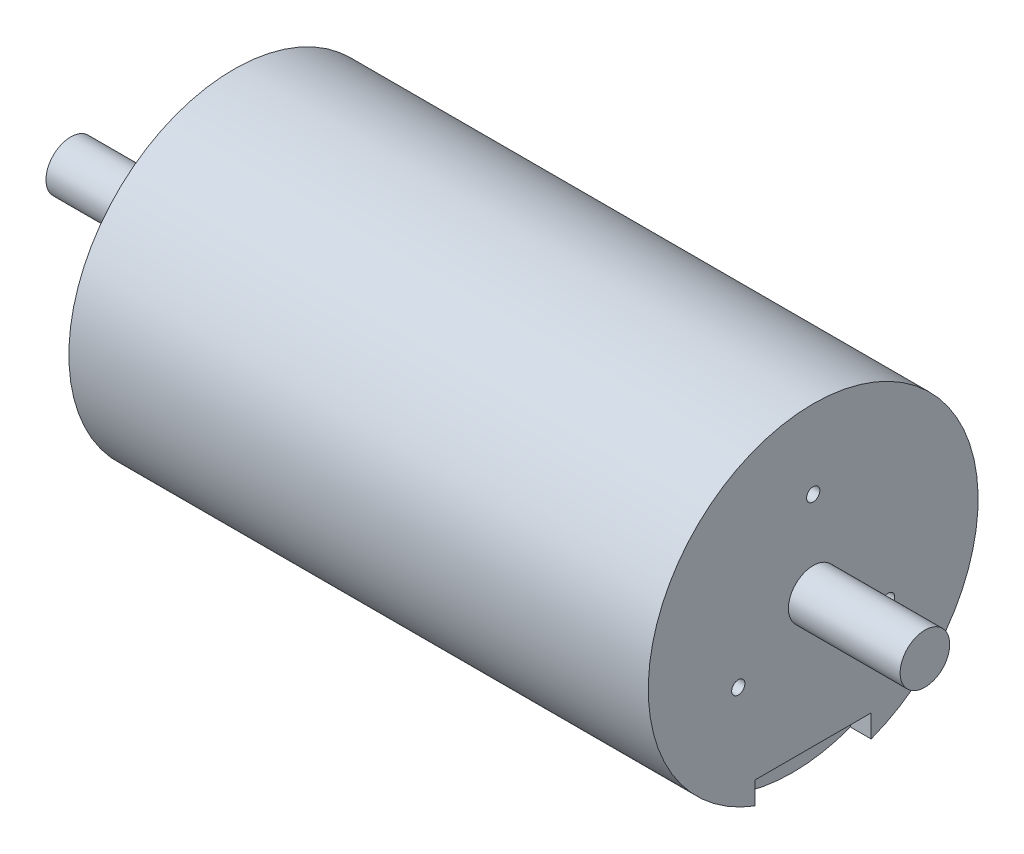
ISO-10303-21;
HEADER;
FILE_DESCRIPTION(('STEP AP214'),'2;1');
FILE_NAME('part.step','',(''),(''),'','','');
FILE_SCHEMA(('AUTOMOTIVE_DESIGN { 1 0 10303 214 1 1 1 1 }'));
ENDSEC;
DATA;
#1=APPLICATION_CONTEXT('core data for automotive mechanical design processes');
#2=APPLICATION_PROTOCOL_DEFINITION('international standard','automotive_design',2000,#1);
#3=PRODUCT_CONTEXT('',#1,'mechanical');
#4=PRODUCT('Part','Part','',(#3));
#5=PRODUCT_RELATED_PRODUCT_CATEGORY('part','',(#4));
#6=PRODUCT_DEFINITION_FORMATION('','',#4);
#7=PRODUCT_DEFINITION_CONTEXT('part definition',#1,'design');
#8=PRODUCT_DEFINITION('design','',#6,#7);
#9=PRODUCT_DEFINITION_SHAPE('','',#8);
#10=(LENGTH_UNIT() NAMED_UNIT(*) SI_UNIT(.MILLI.,.METRE.));
#11=(NAMED_UNIT(*) PLANE_ANGLE_UNIT() SI_UNIT($,.RADIAN.));
#12=(NAMED_UNIT(*) SI_UNIT($,.STERADIAN.) SOLID_ANGLE_UNIT());
#13=UNCERTAINTY_MEASURE_WITH_UNIT(LENGTH_MEASURE(1.E-05),#10,'distance_accuracy_value','');
#14=(GEOMETRIC_REPRESENTATION_CONTEXT(3) GLOBAL_UNCERTAINTY_ASSIGNED_CONTEXT((#13)) GLOBAL_UNIT_ASSIGNED_CONTEXT((#10,
#11,#12)) REPRESENTATION_CONTEXT('',''));
#15=CARTESIAN_POINT('',(0.,0.,0.));
#16=DIRECTION('',(0.,0.,1.));
#17=DIRECTION('',(1.,0.,0.));
#18=AXIS2_PLACEMENT_3D('',#15,#16,#17);
#19=CARTESIAN_POINT('',(89.7,0.,0.));
#20=DIRECTION('',(1.,0.,0.));
#21=DIRECTION('',(0.,0.,-1.));
#22=AXIS2_PLACEMENT_3D('',#19,#20,#21);
#23=PLANE('',#22);
#24=DIRECTION('',(0.,-1.,0.));
#25=VECTOR('',#24,1.);
#26=CARTESIAN_POINT('',(89.7,-15.925,7.));
#27=LINE('',#26,#25);
#28=CARTESIAN_POINT('',(89.7,-15.925,7.));
#29=VERTEX_POINT('',#28);
#30=CARTESIAN_POINT('',(89.7,-18.6549088713936,6.99999999999999));
#31=VERTEX_POINT('',#30);
#32=EDGE_CURVE('E78',#29,#31,#27,.T.);
#33=ORIENTED_EDGE('',*,*,#32,.F.);
#34=DIRECTION('',(0.,0.,1.));
#35=VECTOR('',#34,1.);
#36=CARTESIAN_POINT('',(89.7,-15.925,7.));
#37=LINE('',#36,#35);
#38=CARTESIAN_POINT('',(89.7,-15.925,-7.));
#39=VERTEX_POINT('',#38);
#40=EDGE_CURVE('E425',#39,#29,#37,.T.);
#41=ORIENTED_EDGE('',*,*,#40,.F.);
#42=DIRECTION('',(0.,1.,0.));
#43=VECTOR('',#42,1.);
#44=CARTESIAN_POINT('',(89.7,-15.925,-7.));
#45=LINE('',#44,#43);
#46=CARTESIAN_POINT('',(89.7,-18.6549088713936,-7.));
#47=VERTEX_POINT('',#46);
#48=EDGE_CURVE('E86',#47,#39,#45,.T.);
#49=ORIENTED_EDGE('',*,*,#48,.F.);
#50=CARTESIAN_POINT('',(89.7,0.,0.));
#51=DIRECTION('',(1.,0.,0.));
#52=DIRECTION('',(0.,0.,-1.));
#53=AXIS2_PLACEMENT_3D('',#50,#51,#52);
#54=CIRCLE('',#53,19.925);
#55=EDGE_CURVE('E93',#47,#31,#54,.T.);
#56=ORIENTED_EDGE('',*,*,#55,.T.);
#57=EDGE_LOOP('',(#33,#41,#49,#56));
#58=FACE_BOUND('',#57,.T.);
#59=CARTESIAN_POINT('',(89.7,-5.22500000000004,-9.04996546954736));
#60=DIRECTION('',(1.,0.,0.));
#61=DIRECTION('',(0.,0.,-1.));
#62=AXIS2_PLACEMENT_3D('',#59,#60,#61);
#63=CIRCLE('',#62,0.800000000000001);
#64=CARTESIAN_POINT('',(89.7,-5.22500000000004,-9.84996546954736));
#65=VERTEX_POINT('',#64);
#66=EDGE_CURVE('E437',#65,#65,#63,.T.);
#67=ORIENTED_EDGE('',*,*,#66,.F.);
#68=EDGE_LOOP('',(#67));
#69=FACE_BOUND('',#68,.T.);
#70=CARTESIAN_POINT('',(89.7,-5.22499999999992,9.04996546954743));
#71=DIRECTION('',(1.,0.,0.));
#72=DIRECTION('',(0.,0.,-1.));
#73=AXIS2_PLACEMENT_3D('',#70,#71,#72);
#74=CIRCLE('',#73,0.800000000000002);
#75=CARTESIAN_POINT('',(89.7,-5.22499999999992,8.24996546954743));
#76=VERTEX_POINT('',#75);
#77=EDGE_CURVE('E445',#76,#76,#74,.T.);
#78=ORIENTED_EDGE('',*,*,#77,.F.);
#79=EDGE_LOOP('',(#78));
#80=FACE_BOUND('',#79,.T.);
#81=CARTESIAN_POINT('',(89.7,10.45,0.));
#82=DIRECTION('',(1.,0.,0.));
#83=DIRECTION('',(0.,0.,-1.));
#84=AXIS2_PLACEMENT_3D('',#81,#82,#83);
#85=CIRCLE('',#84,0.8);
#86=CARTESIAN_POINT('',(89.7,10.45,-0.8));
#87=VERTEX_POINT('',#86);
#88=EDGE_CURVE('E451',#87,#87,#85,.T.);
#89=ORIENTED_EDGE('',*,*,#88,.F.);
#90=EDGE_LOOP('',(#89));
#91=FACE_BOUND('',#90,.T.);
#92=CARTESIAN_POINT('',(89.7,0.,0.));
#93=DIRECTION('',(1.,0.,0.));
#94=DIRECTION('',(0.,0.,-1.));
#95=AXIS2_PLACEMENT_3D('',#92,#93,#94);
#96=CIRCLE('',#95,2.9945);
#97=CARTESIAN_POINT('',(89.7,0.,-2.9945));
#98=VERTEX_POINT('',#97);
#99=EDGE_CURVE('E176',#98,#98,#96,.T.);
#100=ORIENTED_EDGE('',*,*,#99,.F.);
#101=EDGE_LOOP('',(#100));
#102=FACE_BOUND('',#101,.T.);
#103=ADVANCED_FACE('F36',(#58,#69,#80,#91,#102),#23,.T.);
#104=CARTESIAN_POINT('',(19.7,0.,0.));
#105=DIRECTION('',(-1.,0.,0.));
#106=DIRECTION('',(0.,0.,1.));
#107=AXIS2_PLACEMENT_3D('',#104,#105,#106);
#108=CYLINDRICAL_SURFACE('',#107,2.9945);
#109=CARTESIAN_POINT('',(0.,0.,0.));
#110=DIRECTION('',(1.,0.,0.));
#111=DIRECTION('',(0.,0.,-1.));
#112=AXIS2_PLACEMENT_3D('',#109,#110,#111);
#113=CIRCLE('',#112,2.9945);
#114=CARTESIAN_POINT('',(0.,0.,-2.9945));
#115=VERTEX_POINT('',#114);
#116=EDGE_CURVE('E44',#115,#115,#113,.T.);
#117=ORIENTED_EDGE('',*,*,#116,.T.);
#118=EDGE_LOOP('',(#117));
#119=FACE_BOUND('',#118,.T.);
#120=CARTESIAN_POINT('',(17.3,0.,0.));
#121=DIRECTION('',(1.,0.,0.));
#122=DIRECTION('',(0.,0.,-1.));
#123=AXIS2_PLACEMENT_3D('',#120,#121,#122);
#124=CIRCLE('',#123,2.9945);
#125=CARTESIAN_POINT('',(17.3,0.,-2.9945));
#126=VERTEX_POINT('',#125);
#127=EDGE_CURVE('E11',#126,#126,#124,.T.);
#128=ORIENTED_EDGE('',*,*,#127,.F.);
#129=EDGE_LOOP('',(#128));
#130=FACE_BOUND('',#129,.T.);
#131=ADVANCED_FACE('F38',(#119,#130),#108,.T.);
#132=CARTESIAN_POINT('',(0.,0.,0.));
#133=DIRECTION('',(1.,0.,0.));
#134=DIRECTION('',(0.,0.,-1.));
#135=AXIS2_PLACEMENT_3D('',#132,#133,#134);
#136=PLANE('',#135);
#137=ORIENTED_EDGE('',*,*,#116,.F.);
#138=EDGE_LOOP('',(#137));
#139=FACE_BOUND('',#138,.T.);
#140=ADVANCED_FACE('F118',(#139),#136,.F.);
#141=CARTESIAN_POINT('',(17.3,0.,0.));
#142=DIRECTION('',(1.,0.,0.));
#143=DIRECTION('',(0.,0.,-1.));
#144=AXIS2_PLACEMENT_3D('',#141,#142,#143);
#145=PLANE('',#144);
#146=CARTESIAN_POINT('',(17.3,0.,0.));
#147=DIRECTION('',(1.,0.,0.));
#148=DIRECTION('',(0.,0.,-1.));
#149=AXIS2_PLACEMENT_3D('',#146,#147,#148);
#150=CIRCLE('',#149,10.975);
#151=CARTESIAN_POINT('',(17.3,0.,-10.975));
#152=VERTEX_POINT('',#151);
#153=EDGE_CURVE('E105',#152,#152,#150,.T.);
#154=ORIENTED_EDGE('',*,*,#153,.F.);
#155=EDGE_LOOP('',(#154));
#156=FACE_BOUND('',#155,.T.);
#157=ORIENTED_EDGE('',*,*,#127,.T.);
#158=EDGE_LOOP('',(#157));
#159=FACE_BOUND('',#158,.T.);
#160=ADVANCED_FACE('F120',(#156,#159),#145,.F.);
#161=CARTESIAN_POINT('',(17.3,0.,0.));
#162=DIRECTION('',(1.,0.,0.));
#163=DIRECTION('',(0.,0.,-1.));
#164=AXIS2_PLACEMENT_3D('',#161,#162,#163);
#165=CYLINDRICAL_SURFACE('',#164,10.975);
#166=ORIENTED_EDGE('',*,*,#153,.T.);
#167=EDGE_LOOP('',(#166));
#168=FACE_BOUND('',#167,.T.);
#169=CARTESIAN_POINT('',(19.7,0.,0.));
#170=DIRECTION('',(1.,0.,0.));
#171=DIRECTION('',(0.,0.,-1.));
#172=AXIS2_PLACEMENT_3D('',#169,#170,#171);
#173=CIRCLE('',#172,10.975);
#174=CARTESIAN_POINT('',(19.7,0.,-10.975));
#175=VERTEX_POINT('',#174);
#176=EDGE_CURVE('E101',#175,#175,#173,.T.);
#177=ORIENTED_EDGE('',*,*,#176,.F.);
#178=EDGE_LOOP('',(#177));
#179=FACE_BOUND('',#178,.T.);
#180=ADVANCED_FACE('F125',(#168,#179),#165,.T.);
#181=CARTESIAN_POINT('',(89.7,0.,0.));
#182=DIRECTION('',(-1.,0.,0.));
#183=DIRECTION('',(0.,0.,1.));
#184=AXIS2_PLACEMENT_3D('',#181,#182,#183);
#185=CYLINDRICAL_SURFACE('',#184,19.925);
#186=CARTESIAN_POINT('',(87.2,5.759281940243E-13,-1.04517089427603E-13));
#187=DIRECTION('',(1.,0.,0.));
#188=DIRECTION('',(0.,0.,-1.));
#189=AXIS2_PLACEMENT_3D('',#186,#187,#188);
#190=CIRCLE('',#189,19.9250000000005);
#191=CARTESIAN_POINT('',(87.2,-18.6549088713936,7.));
#192=VERTEX_POINT('',#191);
#193=CARTESIAN_POINT('',(87.2,-18.6549088713936,-7.));
#194=VERTEX_POINT('',#193);
#195=EDGE_CURVE('E94',#192,#194,#190,.T.);
#196=ORIENTED_EDGE('',*,*,#195,.F.);
#197=DIRECTION('',(1.,0.,0.));
#198=VECTOR('',#197,1.);
#199=CARTESIAN_POINT('',(87.2,-18.6549088713936,6.99999999999999));
#200=LINE('',#199,#198);
#201=EDGE_CURVE('E81',#192,#31,#200,.T.);
#202=ORIENTED_EDGE('',*,*,#201,.T.);
#203=ORIENTED_EDGE('',*,*,#55,.F.);
#204=DIRECTION('',(1.,0.,0.));
#205=VECTOR('',#204,1.);
#206=CARTESIAN_POINT('',(87.2,-18.6549088713936,-7.));
#207=LINE('',#206,#205);
#208=EDGE_CURVE('E95',#194,#47,#207,.T.);
#209=ORIENTED_EDGE('',*,*,#208,.F.);
#210=EDGE_LOOP('',(#196,#202,#203,#209));
#211=FACE_BOUND('',#210,.T.);
#212=CARTESIAN_POINT('',(19.7,0.,0.));
#213=DIRECTION('',(1.,0.,0.));
#214=DIRECTION('',(0.,0.,-1.));
#215=AXIS2_PLACEMENT_3D('',#212,#213,#214);
#216=CIRCLE('',#215,19.925);
#217=CARTESIAN_POINT('',(19.7,0.,-19.925));
#218=VERTEX_POINT('',#217);
#219=EDGE_CURVE('E102',#218,#218,#216,.T.);
#220=ORIENTED_EDGE('',*,*,#219,.T.);
#221=EDGE_LOOP('',(#220));
#222=FACE_BOUND('',#221,.T.);
#223=ADVANCED_FACE('F90',(#211,#222),#185,.T.);
#224=CARTESIAN_POINT('',(19.7,0.,0.));
#225=DIRECTION('',(1.,0.,0.));
#226=DIRECTION('',(0.,0.,-1.));
#227=AXIS2_PLACEMENT_3D('',#224,#225,#226);
#228=PLANE('',#227);
#229=CARTESIAN_POINT('',(19.7,-11.3137084989847,-11.3137084989848));
#230=DIRECTION('',(-1.,0.,0.));
#231=DIRECTION('',(0.,0.,1.));
#232=AXIS2_PLACEMENT_3D('',#229,#230,#231);
#233=CIRCLE('',#232,1.5);
#234=CARTESIAN_POINT('',(19.7,-11.3137084989847,-9.81370849898482));
#235=VERTEX_POINT('',#234);
#236=EDGE_CURVE('E159',#235,#235,#233,.T.);
#237=ORIENTED_EDGE('',*,*,#236,.F.);
#238=EDGE_LOOP('',(#237));
#239=FACE_BOUND('',#238,.T.);
#240=CARTESIAN_POINT('',(19.7,-11.3137084989848,11.3137084989847));
#241=DIRECTION('',(-1.,0.,0.));
#242=DIRECTION('',(0.,0.,1.));
#243=AXIS2_PLACEMENT_3D('',#240,#241,#242);
#244=CIRCLE('',#243,1.5);
#245=CARTESIAN_POINT('',(19.7,-11.3137084989848,12.8137084989847));
#246=VERTEX_POINT('',#245);
#247=EDGE_CURVE('E163',#246,#246,#244,.T.);
#248=ORIENTED_EDGE('',*,*,#247,.F.);
#249=EDGE_LOOP('',(#248));
#250=FACE_BOUND('',#249,.T.);
#251=CARTESIAN_POINT('',(19.7,11.3137084989848,11.3137084989847));
#252=DIRECTION('',(-1.,0.,0.));
#253=DIRECTION('',(0.,0.,1.));
#254=AXIS2_PLACEMENT_3D('',#251,#252,#253);
#255=CIRCLE('',#254,1.5);
#256=CARTESIAN_POINT('',(19.7,11.3137084989848,12.8137084989847));
#257=VERTEX_POINT('',#256);
#258=EDGE_CURVE('E167',#257,#257,#255,.T.);
#259=ORIENTED_EDGE('',*,*,#258,.F.);
#260=EDGE_LOOP('',(#259));
#261=FACE_BOUND('',#260,.T.);
#262=CARTESIAN_POINT('',(19.7,11.3137084989849,-11.3137084989847));
#263=DIRECTION('',(-1.,0.,0.));
#264=DIRECTION('',(0.,0.,1.));
#265=AXIS2_PLACEMENT_3D('',#262,#263,#264);
#266=CIRCLE('',#265,1.5);
#267=CARTESIAN_POINT('',(19.7,11.3137084989849,-9.81370849898466));
#268=VERTEX_POINT('',#267);
#269=EDGE_CURVE('E170',#268,#268,#266,.T.);
#270=ORIENTED_EDGE('',*,*,#269,.F.);
#271=EDGE_LOOP('',(#270));
#272=FACE_BOUND('',#271,.T.);
#273=ORIENTED_EDGE('',*,*,#176,.T.);
#274=EDGE_LOOP('',(#273));
#275=FACE_BOUND('',#274,.T.);
#276=ORIENTED_EDGE('',*,*,#219,.F.);
#277=EDGE_LOOP('',(#276));
#278=FACE_BOUND('',#277,.T.);
#279=ADVANCED_FACE('F135',(#239,#250,#261,#272,#275,#278),#228,.F.);
#280=CARTESIAN_POINT('',(103.2,0.,0.));
#281=DIRECTION('',(-1.,0.,0.));
#282=DIRECTION('',(0.,0.,1.));
#283=AXIS2_PLACEMENT_3D('',#280,#281,#282);
#284=CYLINDRICAL_SURFACE('',#283,2.9945);
#285=CARTESIAN_POINT('',(103.2,0.,0.));
#286=DIRECTION('',(1.,0.,0.));
#287=DIRECTION('',(0.,0.,-1.));
#288=AXIS2_PLACEMENT_3D('',#285,#286,#287);
#289=CIRCLE('',#288,2.9945);
#290=CARTESIAN_POINT('',(103.2,0.,-2.9945));
#291=VERTEX_POINT('',#290);
#292=EDGE_CURVE('E108',#291,#291,#289,.T.);
#293=ORIENTED_EDGE('',*,*,#292,.F.);
#294=EDGE_LOOP('',(#293));
#295=FACE_BOUND('',#294,.T.);
#296=ORIENTED_EDGE('',*,*,#99,.T.);
#297=EDGE_LOOP('',(#296));
#298=FACE_BOUND('',#297,.T.);
#299=ADVANCED_FACE('F148',(#295,#298),#284,.T.);
#300=CARTESIAN_POINT('',(103.2,0.,0.));
#301=DIRECTION('',(1.,0.,0.));
#302=DIRECTION('',(0.,0.,-1.));
#303=AXIS2_PLACEMENT_3D('',#300,#301,#302);
#304=PLANE('',#303);
#305=ORIENTED_EDGE('',*,*,#292,.T.);
#306=EDGE_LOOP('',(#305));
#307=FACE_BOUND('',#306,.T.);
#308=ADVANCED_FACE('F154',(#307),#304,.T.);
#309=CARTESIAN_POINT('',(27.7,11.3137084989849,-11.3137084989847));
#310=DIRECTION('',(-1.,0.,0.));
#311=DIRECTION('',(0.,0.,1.));
#312=AXIS2_PLACEMENT_3D('',#309,#310,#311);
#313=CYLINDRICAL_SURFACE('',#312,1.5);
#314=CARTESIAN_POINT('',(27.7,11.3137084989849,-11.3137084989847));
#315=DIRECTION('',(-1.,0.,0.));
#316=DIRECTION('',(0.,0.,1.));
#317=AXIS2_PLACEMENT_3D('',#314,#315,#316);
#318=CIRCLE('',#317,1.5);
#319=CARTESIAN_POINT('',(27.7,11.3137084989849,-9.81370849898466));
#320=VERTEX_POINT('',#319);
#321=EDGE_CURVE('E172',#320,#320,#318,.T.);
#322=ORIENTED_EDGE('',*,*,#321,.F.);
#323=EDGE_LOOP('',(#322));
#324=FACE_BOUND('',#323,.T.);
#325=ORIENTED_EDGE('',*,*,#269,.T.);
#326=EDGE_LOOP('',(#325));
#327=FACE_BOUND('',#326,.T.);
#328=ADVANCED_FACE('F190',(#324,#327),#313,.F.);
#329=CARTESIAN_POINT('',(27.7,-43.9764213562373,0.));
#330=DIRECTION('',(-1.,0.,0.));
#331=DIRECTION('',(0.,0.,1.));
#332=AXIS2_PLACEMENT_3D('',#329,#330,#331);
#333=PLANE('',#332);
#334=ORIENTED_EDGE('',*,*,#321,.T.);
#335=EDGE_LOOP('',(#334));
#336=FACE_BOUND('',#335,.T.);
#337=ADVANCED_FACE('F195',(#336),#333,.T.);
#338=CARTESIAN_POINT('',(27.7,11.3137084989848,11.3137084989847));
#339=DIRECTION('',(-1.,0.,0.));
#340=DIRECTION('',(0.,0.,1.));
#341=AXIS2_PLACEMENT_3D('',#338,#339,#340);
#342=CYLINDRICAL_SURFACE('',#341,1.5);
#343=CARTESIAN_POINT('',(27.7,11.3137084989848,11.3137084989847));
#344=DIRECTION('',(-1.,0.,0.));
#345=DIRECTION('',(0.,0.,1.));
#346=AXIS2_PLACEMENT_3D('',#343,#344,#345);
#347=CIRCLE('',#346,1.5);
#348=CARTESIAN_POINT('',(27.7,11.3137084989848,12.8137084989847));
#349=VERTEX_POINT('',#348);
#350=EDGE_CURVE('E173',#349,#349,#347,.T.);
#351=ORIENTED_EDGE('',*,*,#350,.F.);
#352=EDGE_LOOP('',(#351));
#353=FACE_BOUND('',#352,.T.);
#354=ORIENTED_EDGE('',*,*,#258,.T.);
#355=EDGE_LOOP('',(#354));
#356=FACE_BOUND('',#355,.T.);
#357=ADVANCED_FACE('F201',(#353,#356),#342,.F.);
#358=CARTESIAN_POINT('',(27.7,-43.9764213562373,0.));
#359=DIRECTION('',(-1.,0.,0.));
#360=DIRECTION('',(0.,0.,1.));
#361=AXIS2_PLACEMENT_3D('',#358,#359,#360);
#362=PLANE('',#361);
#363=ORIENTED_EDGE('',*,*,#350,.T.);
#364=EDGE_LOOP('',(#363));
#365=FACE_BOUND('',#364,.T.);
#366=ADVANCED_FACE('F205',(#365),#362,.T.);
#367=CARTESIAN_POINT('',(27.7,-11.3137084989848,11.3137084989847));
#368=DIRECTION('',(-1.,0.,0.));
#369=DIRECTION('',(0.,0.,1.));
#370=AXIS2_PLACEMENT_3D('',#367,#368,#369);
#371=CYLINDRICAL_SURFACE('',#370,1.5);
#372=CARTESIAN_POINT('',(27.7,-11.3137084989848,11.3137084989847));
#373=DIRECTION('',(-1.,0.,0.));
#374=DIRECTION('',(0.,0.,1.));
#375=AXIS2_PLACEMENT_3D('',#372,#373,#374);
#376=CIRCLE('',#375,1.5);
#377=CARTESIAN_POINT('',(27.7,-11.3137084989848,12.8137084989847));
#378=VERTEX_POINT('',#377);
#379=EDGE_CURVE('E462',#378,#378,#376,.T.);
#380=ORIENTED_EDGE('',*,*,#379,.F.);
#381=EDGE_LOOP('',(#380));
#382=FACE_BOUND('',#381,.T.);
#383=ORIENTED_EDGE('',*,*,#247,.T.);
#384=EDGE_LOOP('',(#383));
#385=FACE_BOUND('',#384,.T.);
#386=ADVANCED_FACE('F209',(#382,#385),#371,.F.);
#387=CARTESIAN_POINT('',(27.7,-43.9764213562373,0.));
#388=DIRECTION('',(-1.,0.,0.));
#389=DIRECTION('',(0.,0.,1.));
#390=AXIS2_PLACEMENT_3D('',#387,#388,#389);
#391=PLANE('',#390);
#392=ORIENTED_EDGE('',*,*,#379,.T.);
#393=EDGE_LOOP('',(#392));
#394=FACE_BOUND('',#393,.T.);
#395=ADVANCED_FACE('F213',(#394),#391,.T.);
#396=CARTESIAN_POINT('',(27.7,-11.3137084989847,-11.3137084989848));
#397=DIRECTION('',(-1.,0.,0.));
#398=DIRECTION('',(0.,0.,1.));
#399=AXIS2_PLACEMENT_3D('',#396,#397,#398);
#400=CYLINDRICAL_SURFACE('',#399,1.5);
#401=CARTESIAN_POINT('',(27.7,-11.3137084989847,-11.3137084989848));
#402=DIRECTION('',(-1.,0.,0.));
#403=DIRECTION('',(0.,0.,1.));
#404=AXIS2_PLACEMENT_3D('',#401,#402,#403);
#405=CIRCLE('',#404,1.5);
#406=CARTESIAN_POINT('',(27.7,-11.3137084989847,-9.81370849898482));
#407=VERTEX_POINT('',#406);
#408=EDGE_CURVE('E458',#407,#407,#405,.T.);
#409=ORIENTED_EDGE('',*,*,#408,.F.);
#410=EDGE_LOOP('',(#409));
#411=FACE_BOUND('',#410,.T.);
#412=ORIENTED_EDGE('',*,*,#236,.T.);
#413=EDGE_LOOP('',(#412));
#414=FACE_BOUND('',#413,.T.);
#415=ADVANCED_FACE('F217',(#411,#414),#400,.F.);
#416=CARTESIAN_POINT('',(27.7,-43.9764213562373,0.));
#417=DIRECTION('',(-1.,0.,0.));
#418=DIRECTION('',(0.,0.,1.));
#419=AXIS2_PLACEMENT_3D('',#416,#417,#418);
#420=PLANE('',#419);
#421=ORIENTED_EDGE('',*,*,#408,.T.);
#422=EDGE_LOOP('',(#421));
#423=FACE_BOUND('',#422,.T.);
#424=ADVANCED_FACE('F221',(#423),#420,.T.);
#425=CARTESIAN_POINT('',(85.7,10.45,0.));
#426=DIRECTION('',(1.,0.,0.));
#427=DIRECTION('',(0.,0.,-1.));
#428=AXIS2_PLACEMENT_3D('',#425,#426,#427);
#429=CYLINDRICAL_SURFACE('',#428,0.8);
#430=CARTESIAN_POINT('',(85.7,10.45,0.));
#431=DIRECTION('',(1.,0.,0.));
#432=DIRECTION('',(0.,0.,-1.));
#433=AXIS2_PLACEMENT_3D('',#430,#431,#432);
#434=CIRCLE('',#433,0.8);
#435=CARTESIAN_POINT('',(85.7,10.45,-0.8));
#436=VERTEX_POINT('',#435);
#437=EDGE_CURVE('E454',#436,#436,#434,.T.);
#438=ORIENTED_EDGE('',*,*,#437,.F.);
#439=EDGE_LOOP('',(#438));
#440=FACE_BOUND('',#439,.T.);
#441=ORIENTED_EDGE('',*,*,#88,.T.);
#442=EDGE_LOOP('',(#441));
#443=FACE_BOUND('',#442,.T.);
#444=ADVANCED_FACE('F225',(#440,#443),#429,.F.);
#445=CARTESIAN_POINT('',(85.7,0.,-43.9764213562373));
#446=DIRECTION('',(1.,0.,0.));
#447=DIRECTION('',(0.,0.,-1.));
#448=AXIS2_PLACEMENT_3D('',#445,#446,#447);
#449=PLANE('',#448);
#450=ORIENTED_EDGE('',*,*,#437,.T.);
#451=EDGE_LOOP('',(#450));
#452=FACE_BOUND('',#451,.T.);
#453=ADVANCED_FACE('F229',(#452),#449,.T.);
#454=CARTESIAN_POINT('',(85.7,-5.22499999999992,9.04996546954743));
#455=DIRECTION('',(1.,0.,0.));
#456=DIRECTION('',(0.,0.,-1.));
#457=AXIS2_PLACEMENT_3D('',#454,#455,#456);
#458=CYLINDRICAL_SURFACE('',#457,0.800000000000002);
#459=CARTESIAN_POINT('',(85.7,-5.22499999999992,9.04996546954743));
#460=DIRECTION('',(1.,0.,0.));
#461=DIRECTION('',(0.,0.,-1.));
#462=AXIS2_PLACEMENT_3D('',#459,#460,#461);
#463=CIRCLE('',#462,0.800000000000002);
#464=CARTESIAN_POINT('',(85.7,-5.22499999999992,8.24996546954743));
#465=VERTEX_POINT('',#464);
#466=EDGE_CURVE('E448',#465,#465,#463,.T.);
#467=ORIENTED_EDGE('',*,*,#466,.F.);
#468=EDGE_LOOP('',(#467));
#469=FACE_BOUND('',#468,.T.);
#470=ORIENTED_EDGE('',*,*,#77,.T.);
#471=EDGE_LOOP('',(#470));
#472=FACE_BOUND('',#471,.T.);
#473=ADVANCED_FACE('F233',(#469,#472),#458,.F.);
#474=CARTESIAN_POINT('',(85.7,0.,-43.9764213562373));
#475=DIRECTION('',(1.,0.,0.));
#476=DIRECTION('',(0.,0.,-1.));
#477=AXIS2_PLACEMENT_3D('',#474,#475,#476);
#478=PLANE('',#477);
#479=ORIENTED_EDGE('',*,*,#466,.T.);
#480=EDGE_LOOP('',(#479));
#481=FACE_BOUND('',#480,.T.);
#482=ADVANCED_FACE('F237',(#481),#478,.T.);
#483=CARTESIAN_POINT('',(85.7,-5.22500000000004,-9.04996546954736));
#484=DIRECTION('',(1.,0.,0.));
#485=DIRECTION('',(0.,0.,-1.));
#486=AXIS2_PLACEMENT_3D('',#483,#484,#485);
#487=CYLINDRICAL_SURFACE('',#486,0.800000000000001);
#488=CARTESIAN_POINT('',(85.7,-5.22500000000004,-9.04996546954736));
#489=DIRECTION('',(1.,0.,0.));
#490=DIRECTION('',(0.,0.,-1.));
#491=AXIS2_PLACEMENT_3D('',#488,#489,#490);
#492=CIRCLE('',#491,0.800000000000001);
#493=CARTESIAN_POINT('',(85.7,-5.22500000000004,-9.84996546954736));
#494=VERTEX_POINT('',#493);
#495=EDGE_CURVE('E442',#494,#494,#492,.T.);
#496=ORIENTED_EDGE('',*,*,#495,.F.);
#497=EDGE_LOOP('',(#496));
#498=FACE_BOUND('',#497,.T.);
#499=ORIENTED_EDGE('',*,*,#66,.T.);
#500=EDGE_LOOP('',(#499));
#501=FACE_BOUND('',#500,.T.);
#502=ADVANCED_FACE('F241',(#498,#501),#487,.F.);
#503=CARTESIAN_POINT('',(85.7,0.,-43.9764213562373));
#504=DIRECTION('',(1.,0.,0.));
#505=DIRECTION('',(0.,0.,-1.));
#506=AXIS2_PLACEMENT_3D('',#503,#504,#505);
#507=PLANE('',#506);
#508=ORIENTED_EDGE('',*,*,#495,.T.);
#509=EDGE_LOOP('',(#508));
#510=FACE_BOUND('',#509,.T.);
#511=ADVANCED_FACE('F245',(#510),#507,.T.);
#512=CARTESIAN_POINT('',(87.2,-15.925,7.));
#513=DIRECTION('',(0.,0.,1.));
#514=DIRECTION('',(1.,0.,0.));
#515=AXIS2_PLACEMENT_3D('',#512,#513,#514);
#516=PLANE('',#515);
#517=ORIENTED_EDGE('',*,*,#32,.T.);
#518=ORIENTED_EDGE('',*,*,#201,.F.);
#519=DIRECTION('',(0.,-1.,0.));
#520=VECTOR('',#519,1.);
#521=CARTESIAN_POINT('',(87.2,-15.925,7.));
#522=LINE('',#521,#520);
#523=CARTESIAN_POINT('',(87.2,-15.925,7.));
#524=VERTEX_POINT('',#523);
#525=EDGE_CURVE('E51',#524,#192,#522,.T.);
#526=ORIENTED_EDGE('',*,*,#525,.F.);
#527=DIRECTION('',(1.,0.,0.));
#528=VECTOR('',#527,1.);
#529=CARTESIAN_POINT('',(87.2,-15.925,7.));
#530=LINE('',#529,#528);
#531=EDGE_CURVE('E59',#524,#29,#530,.T.);
#532=ORIENTED_EDGE('',*,*,#531,.T.);
#533=EDGE_LOOP('',(#517,#518,#526,#532));
#534=FACE_BOUND('',#533,.T.);
#535=ADVANCED_FACE('F80',(#534),#516,.F.);
#536=CARTESIAN_POINT('',(87.2,-15.925,7.));
#537=DIRECTION('',(0.,1.,0.));
#538=DIRECTION('',(0.,0.,1.));
#539=AXIS2_PLACEMENT_3D('',#536,#537,#538);
#540=PLANE('',#539);
#541=ORIENTED_EDGE('',*,*,#40,.T.);
#542=ORIENTED_EDGE('',*,*,#531,.F.);
#543=DIRECTION('',(0.,0.,1.));
#544=VECTOR('',#543,1.);
#545=CARTESIAN_POINT('',(87.2,-15.925,7.));
#546=LINE('',#545,#544);
#547=CARTESIAN_POINT('',(87.2,-15.925,-7.));
#548=VERTEX_POINT('',#547);
#549=EDGE_CURVE('E96',#548,#524,#546,.T.);
#550=ORIENTED_EDGE('',*,*,#549,.F.);
#551=DIRECTION('',(1.,0.,0.));
#552=VECTOR('',#551,1.);
#553=CARTESIAN_POINT('',(87.2,-15.925,-7.));
#554=LINE('',#553,#552);
#555=EDGE_CURVE('E426',#548,#39,#554,.T.);
#556=ORIENTED_EDGE('',*,*,#555,.T.);
#557=EDGE_LOOP('',(#541,#542,#550,#556));
#558=FACE_BOUND('',#557,.T.);
#559=ADVANCED_FACE('F252',(#558),#540,.F.);
#560=CARTESIAN_POINT('',(87.2,-15.925,-7.));
#561=DIRECTION('',(0.,0.,-1.));
#562=DIRECTION('',(-1.,0.,0.));
#563=AXIS2_PLACEMENT_3D('',#560,#561,#562);
#564=PLANE('',#563);
#565=ORIENTED_EDGE('',*,*,#48,.T.);
#566=ORIENTED_EDGE('',*,*,#555,.F.);
#567=DIRECTION('',(0.,1.,0.));
#568=VECTOR('',#567,1.);
#569=CARTESIAN_POINT('',(87.2,-15.925,-7.));
#570=LINE('',#569,#568);
#571=EDGE_CURVE('E432',#194,#548,#570,.T.);
#572=ORIENTED_EDGE('',*,*,#571,.F.);
#573=ORIENTED_EDGE('',*,*,#208,.T.);
#574=EDGE_LOOP('',(#565,#566,#572,#573));
#575=FACE_BOUND('',#574,.T.);
#576=ADVANCED_FACE('F253',(#575),#564,.F.);
#577=CARTESIAN_POINT('',(87.2,5.759281940243E-13,-1.04517089427603E-13));
#578=DIRECTION('',(1.,0.,0.));
#579=DIRECTION('',(0.,0.,-1.));
#580=AXIS2_PLACEMENT_3D('',#577,#578,#579);
#581=PLANE('',#580);
#582=ORIENTED_EDGE('',*,*,#525,.T.);
#583=ORIENTED_EDGE('',*,*,#195,.T.);
#584=ORIENTED_EDGE('',*,*,#571,.T.);
#585=ORIENTED_EDGE('',*,*,#549,.T.);
#586=EDGE_LOOP('',(#582,#583,#584,#585));
#587=FACE_BOUND('',#586,.T.);
#588=ADVANCED_FACE('F256',(#587),#581,.T.);
#589=CLOSED_SHELL('',(#103,#131,#140,#160,#180,#223,#279,#299,#308,#328,#337,#357,#366,#386,
#395,#415,#424,#444,#453,#473,#482,#502,#511,#535,#559,#576,#588));
#590=MANIFOLD_SOLID_BREP('B2',#589);
#591=ADVANCED_BREP_SHAPE_REPRESENTATION('',(#18,#590),#14);
#592=SHAPE_DEFINITION_REPRESENTATION(#9,#591);
ENDSEC;
END-ISO-10303-21;
